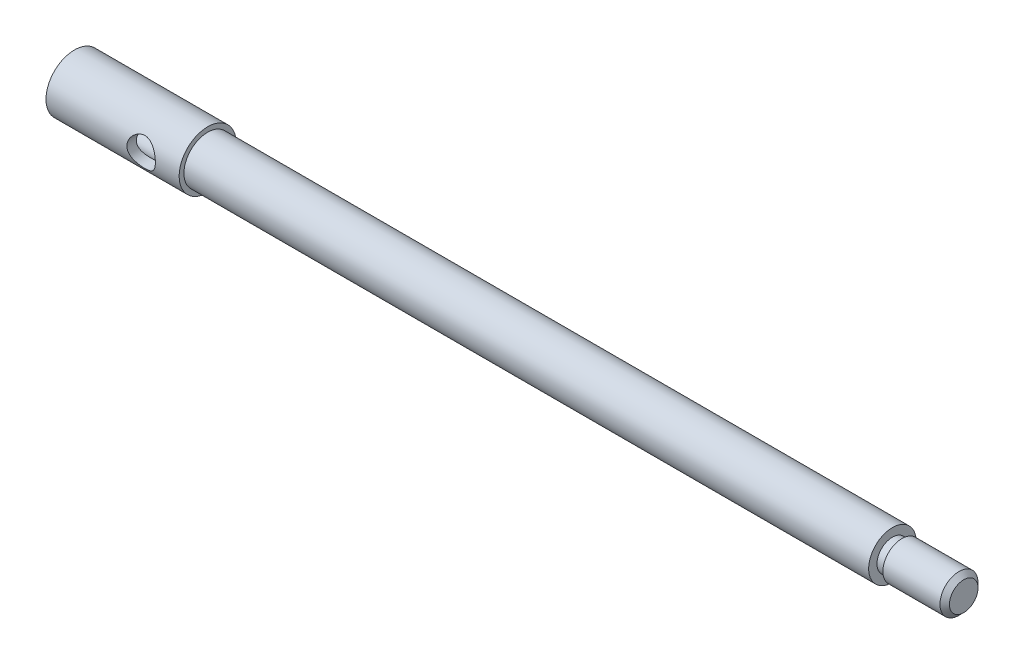
ISO-10303-21;
HEADER;
FILE_DESCRIPTION(('STEP AP214'),'2;1');
FILE_NAME('part.step','',(''),(''),'','','');
FILE_SCHEMA(('AUTOMOTIVE_DESIGN { 1 0 10303 214 1 1 1 1 }'));
ENDSEC;
DATA;
#1=APPLICATION_CONTEXT('core data for automotive mechanical design processes');
#2=APPLICATION_PROTOCOL_DEFINITION('international standard','automotive_design',2000,#1);
#3=PRODUCT_CONTEXT('',#1,'mechanical');
#4=PRODUCT('Part','Part','',(#3));
#5=PRODUCT_RELATED_PRODUCT_CATEGORY('part','',(#4));
#6=PRODUCT_DEFINITION_FORMATION('','',#4);
#7=PRODUCT_DEFINITION_CONTEXT('part definition',#1,'design');
#8=PRODUCT_DEFINITION('design','',#6,#7);
#9=PRODUCT_DEFINITION_SHAPE('','',#8);
#10=(LENGTH_UNIT() NAMED_UNIT(*) SI_UNIT(.MILLI.,.METRE.));
#11=(NAMED_UNIT(*) PLANE_ANGLE_UNIT() SI_UNIT($,.RADIAN.));
#12=(NAMED_UNIT(*) SI_UNIT($,.STERADIAN.) SOLID_ANGLE_UNIT());
#13=UNCERTAINTY_MEASURE_WITH_UNIT(LENGTH_MEASURE(1.E-05),#10,'distance_accuracy_value','');
#14=(GEOMETRIC_REPRESENTATION_CONTEXT(3) GLOBAL_UNCERTAINTY_ASSIGNED_CONTEXT((#13)) GLOBAL_UNIT_ASSIGNED_CONTEXT((#10,
#11,#12)) REPRESENTATION_CONTEXT('',''));
#15=CARTESIAN_POINT('',(0.,0.,0.));
#16=DIRECTION('',(0.,0.,1.));
#17=DIRECTION('',(1.,0.,0.));
#18=AXIS2_PLACEMENT_3D('',#15,#16,#17);
#19=CARTESIAN_POINT('',(-187.,0.,0.));
#20=DIRECTION('',(1.,0.,0.));
#21=DIRECTION('',(0.,0.,-1.));
#22=AXIS2_PLACEMENT_3D('',#19,#20,#21);
#23=CYLINDRICAL_SURFACE('',#22,6.);
#24=CARTESIAN_POINT('',(-187.,0.,0.));
#25=DIRECTION('',(-1.,0.,0.));
#26=DIRECTION('',(0.,0.,1.));
#27=AXIS2_PLACEMENT_3D('',#24,#25,#26);
#28=CIRCLE('',#27,6.);
#29=CARTESIAN_POINT('',(-187.,0.,6.));
#30=VERTEX_POINT('',#29);
#31=EDGE_CURVE('E66',#30,#30,#28,.T.);
#32=ORIENTED_EDGE('',*,*,#31,.F.);
#33=EDGE_LOOP('',(#32));
#34=FACE_BOUND('',#33,.T.);
#35=CARTESIAN_POINT('',(-159.,0.,0.));
#36=DIRECTION('',(-1.,0.,0.));
#37=DIRECTION('',(0.,0.,1.));
#38=AXIS2_PLACEMENT_3D('',#35,#36,#37);
#39=CIRCLE('',#38,6.);
#40=CARTESIAN_POINT('',(-159.,0.,6.));
#41=VERTEX_POINT('',#40);
#42=EDGE_CURVE('E62',#41,#41,#39,.T.);
#43=ORIENTED_EDGE('',*,*,#42,.T.);
#44=EDGE_LOOP('',(#43));
#45=FACE_BOUND('',#44,.T.);
#46=CARTESIAN_POINT('',(-170.,0.,6.));
#47=CARTESIAN_POINT('',(-169.99999916126,-0.0788941476270894,5.99999934964153));
#48=CARTESIAN_POINT('',(-169.996882054524,-0.157796620407949,5.99843869002385));
#49=CARTESIAN_POINT('',(-169.98446072826,-0.315001991255921,5.99224358793258));
#50=CARTESIAN_POINT('',(-169.975153725935,-0.393304603620534,5.98760776295702));
#51=CARTESIAN_POINT('',(-169.938042143181,-0.626628691373742,5.96921978027472));
#52=CARTESIAN_POINT('',(-169.901047170937,-0.779952894844981,5.95098734455496));
#53=CARTESIAN_POINT('',(-169.804418225571,-1.07683586335997,5.90448966743082));
#54=CARTESIAN_POINT('',(-169.744872233792,-1.22043005484386,5.87626344365678));
#55=CARTESIAN_POINT('',(-169.605288749321,-1.49540820515376,5.81237302716333));
#56=CARTESIAN_POINT('',(-169.525252872297,-1.62679312559149,5.77670942093694));
#57=CARTESIAN_POINT('',(-169.341446019151,-1.88252701271778,5.69868752298932));
#58=CARTESIAN_POINT('',(-169.236532052479,-2.0059694541685,5.65605474586613));
#59=CARTESIAN_POINT('',(-169.008444078513,-2.23433451090185,5.56980033629331));
#60=CARTESIAN_POINT('',(-168.885256286835,-2.3392430135573,5.5261779786051));
#61=CARTESIAN_POINT('',(-168.612515639918,-2.53576864722248,5.43896347969577));
#62=CARTESIAN_POINT('',(-168.461659025542,-2.625724111766,5.3956360268673));
#63=CARTESIAN_POINT('',(-168.224049145977,-2.74034031450289,5.33782449719395));
#64=CARTESIAN_POINT('',(-168.142929075437,-2.77516786882116,5.31974570840246));
#65=CARTESIAN_POINT('',(-167.97739942012,-2.83769299596483,5.28665768365287));
#66=CARTESIAN_POINT('',(-167.892991812742,-2.86539478083935,5.27164663543394));
#67=CARTESIAN_POINT('',(-167.726604203238,-2.91188280266505,5.24610341708084));
#68=CARTESIAN_POINT('',(-167.644777203244,-2.93110042292906,5.23535838565203));
#69=CARTESIAN_POINT('',(-167.47944509148,-2.96263559384679,5.21757784151146));
#70=CARTESIAN_POINT('',(-167.395940894459,-2.97495680535109,5.21054036082126));
#71=CARTESIAN_POINT('',(-167.227993632584,-2.99251382412704,5.20047756645272));
#72=CARTESIAN_POINT('',(-167.143551164106,-2.99775389857937,5.19744983647106));
#73=CARTESIAN_POINT('',(-166.974506345659,-3.00108452416054,5.19552555967192));
#74=CARTESIAN_POINT('',(-166.889904011712,-2.9991757574161,5.19662861870362));
#75=CARTESIAN_POINT('',(-166.657246101678,-2.98404973540404,5.20534668059274));
#76=CARTESIAN_POINT('',(-166.509755845846,-2.96335042632723,5.21726794353739));
#77=CARTESIAN_POINT('',(-166.220806323175,-2.90082280036694,5.25228182412118));
#78=CARTESIAN_POINT('',(-166.079348993049,-2.85898775295595,5.2753780002338));
#79=CARTESIAN_POINT('',(-165.802320349703,-2.75462843937305,5.33062568888727));
#80=CARTESIAN_POINT('',(-165.666962888249,-2.69164495870316,5.36297559567996));
#81=CARTESIAN_POINT('',(-165.408095036686,-2.54712530575799,5.43310175251306));
#82=CARTESIAN_POINT('',(-165.28459000352,-2.46558080007524,5.47088043711311));
#83=CARTESIAN_POINT('',(-165.03643690622,-2.27419808739746,5.55339485686877));
#84=CARTESIAN_POINT('',(-164.913629557616,-2.16208335434884,5.59840533924979));
#85=CARTESIAN_POINT('',(-164.687793565798,-1.918666756993,5.6864286668495));
#86=CARTESIAN_POINT('',(-164.584774375094,-1.78735577540357,5.72944054996685));
#87=CARTESIAN_POINT('',(-164.396943067981,-1.50154951155101,5.81105962769461));
#88=CARTESIAN_POINT('',(-164.313198596302,-1.34626077321059,5.84936952731879));
#89=CARTESIAN_POINT('',(-164.173708899242,-1.02139864805274,5.91473643118065));
#90=CARTESIAN_POINT('',(-164.11794144145,-0.851836729203675,5.94180236767508));
#91=CARTESIAN_POINT('',(-164.040573792064,-0.518299474608029,5.97973001282228));
#92=CARTESIAN_POINT('',(-164.016526293618,-0.355024591545112,5.99174814919366));
#93=CARTESIAN_POINT('',(-163.995605805738,-0.0263387999478738,6.00219040361882));
#94=CARTESIAN_POINT('',(-163.998719942861,0.139071059584267,6.00062096160122));
#95=CARTESIAN_POINT('',(-164.03062006546,0.453698915981443,5.98473576763842));
#96=CARTESIAN_POINT('',(-164.057397598244,0.60317822415514,5.97141737064974));
#97=CARTESIAN_POINT('',(-164.132714215631,0.895220676900472,5.93466513944052));
#98=CARTESIAN_POINT('',(-164.181255699349,1.03778305707535,5.91123019004896));
#99=CARTESIAN_POINT('',(-164.299995399311,1.31666582534657,5.85552754239056));
#100=CARTESIAN_POINT('',(-164.370773150341,1.45269119100304,5.82302645301465));
#101=CARTESIAN_POINT('',(-164.531322606947,1.71138408511219,5.75231922959683));
#102=CARTESIAN_POINT('',(-164.621102403829,1.83404588938514,5.71411066728832));
#103=CARTESIAN_POINT('',(-164.827281275944,2.07530306780483,5.63124663977895));
#104=CARTESIAN_POINT('',(-164.945428605145,2.19231623321554,5.58632654410487));
#105=CARTESIAN_POINT('',(-165.199775453685,2.40556896301296,5.49787174706806));
#106=CARTESIAN_POINT('',(-165.33598735658,2.50179415686849,5.45433802170281));
#107=CARTESIAN_POINT('',(-165.63093096248,2.675123743717,5.3715357665078));
#108=CARTESIAN_POINT('',(-165.790433797963,2.75107648817021,5.33257588763926));
#109=CARTESIAN_POINT('',(-166.122530203045,2.87424847703564,5.26722216885657));
#110=CARTESIAN_POINT('',(-166.295106580643,2.92150474480837,5.24081214709482));
#111=CARTESIAN_POINT('',(-166.630730667531,2.9815850649252,5.2068450303742));
#112=CARTESIAN_POINT('',(-166.79310275629,2.997278998202,5.19772150245586));
#113=CARTESIAN_POINT('',(-167.118341205507,3.00206745414685,5.19496064074355));
#114=CARTESIAN_POINT('',(-167.281207321143,2.99117350647291,5.20131659437267));
#115=CARTESIAN_POINT('',(-167.586450491094,2.94577840699521,5.227135856483));
#116=CARTESIAN_POINT('',(-167.729301362266,2.91362505078136,5.24529281646868));
#117=CARTESIAN_POINT('',(-168.007424406457,2.82952596688628,5.29113050364646));
#118=CARTESIAN_POINT('',(-168.142694125528,2.77757387249734,5.31881429411661));
#119=CARTESIAN_POINT('',(-168.411874361665,2.65144766382427,5.38285583940632));
#120=CARTESIAN_POINT('',(-168.545082969479,2.57601505988082,5.41967139666624));
#121=CARTESIAN_POINT('',(-168.797824344936,2.4064512676201,5.49706022440066));
#122=CARTESIAN_POINT('',(-168.917349946404,2.3123103512076,5.53763544397051));
#123=CARTESIAN_POINT('',(-169.154422857488,2.094616891292,5.62386853947507));
#124=CARTESIAN_POINT('',(-169.269965124161,1.96888052183389,5.66954494371953));
#125=CARTESIAN_POINT('',(-169.478801140071,1.69843715077041,5.75633712356327));
#126=CARTESIAN_POINT('',(-169.572082897022,1.55371998850182,5.79745043456127));
#127=CARTESIAN_POINT('',(-169.693178184557,1.32452333533411,5.85251406841986));
#128=CARTESIAN_POINT('',(-169.730520200242,1.24575314775786,5.86982524242744));
#129=CARTESIAN_POINT('',(-169.798361678824,1.08479725492718,5.90168845962536));
#130=CARTESIAN_POINT('',(-169.828864497033,1.0026132480538,5.91624185523758));
#131=CARTESIAN_POINT('',(-169.882607255993,0.835616997915662,5.94212690185116));
#132=CARTESIAN_POINT('',(-169.905863040764,0.750810940130687,5.95346557615479));
#133=CARTESIAN_POINT('',(-169.944882572781,0.579142357408355,5.97260771878739));
#134=CARTESIAN_POINT('',(-169.960650896556,0.492281122825507,5.98041334646939));
#135=CARTESIAN_POINT('',(-169.981684678614,0.337824895315458,5.99085829855372));
#136=CARTESIAN_POINT('',(-169.988546917726,0.270495162095326,5.99428035414515));
#137=CARTESIAN_POINT('',(-169.997705001443,0.135445671381779,5.99885151538357));
#138=CARTESIAN_POINT('',(-170.000000720009,0.0677259031748615,6.00000055829382));
#139=CARTESIAN_POINT('',(-170.,0.,6.));
#140=B_SPLINE_CURVE_WITH_KNOTS('',3,(#46,#47,#48,#49,#50,#51,#52,#53,#54,#55,#56,#57,#58,#59,
#60,#61,#62,#63,#64,#65,#66,#67,#68,#69,#70,#71,#72,#73,#74,#75,#76,#77,#78,#79,#80,#81,#82,#83,
#84,#85,#86,#87,#88,#89,#90,#91,#92,#93,#94,#95,#96,#97,#98,#99,#100,#101,#102,#103,#104,#105,
#106,#107,#108,#109,#110,#111,#112,#113,#114,#115,#116,#117,#118,#119,#120,#121,#122,#123,#124,
#125,#126,#127,#128,#129,#130,#131,#132,#133,#134,#135,#136,#137,#138,#139),.UNSPECIFIED.,.T.,
.F.,(4,2,2,2,2,2,2,2,2,2,2,2,2,2,2,2,2,2,2,2,2,2,2,2,2,2,2,2,2,2,2,2,2,2,2,2,2,2,2,2,2,2,2,2,2,
2,4),(0.,0.236611432443576,0.473329310437698,0.947100987304418,1.41904300465373,
1.89094781992153,2.39140181433109,2.89223525113893,3.43190833109938,3.70192714967834,
3.97178599119152,4.22563720033306,4.47935352842579,4.73291689564219,4.98645606901567,
5.43238672147388,5.87845946700876,6.334922554293,6.79159098704506,7.30616358925478,
7.82098138719903,8.35970601567164,8.8980018566068,9.39171406337878,9.88519228458269,
10.3404225444221,10.7957029981664,11.2640010300754,11.7324988716886,12.2470036685628,
12.7618630076938,13.3016558140826,13.8407507075944,14.3280945743222,14.8152271451712,
15.2559532566965,15.6968212128813,16.1673090526394,16.6380421835397,17.1659726319345,
17.6941868506379,17.9605054214137,18.2266930489271,18.4922945660821,18.7577335310501,
18.9608446764331,19.1639614277476),.UNSPECIFIED.);
#141=CARTESIAN_POINT('',(-170.,0.,6.));
#142=VERTEX_POINT('',#141);
#143=EDGE_CURVE('E106',#142,#142,#140,.T.);
#144=ORIENTED_EDGE('',*,*,#143,.F.);
#145=EDGE_LOOP('',(#144));
#146=FACE_BOUND('',#145,.T.);
#147=CARTESIAN_POINT('',(-170.,0.,-6.));
#148=CARTESIAN_POINT('',(-169.99999916126,0.0788941476270894,-5.99999934964153));
#149=CARTESIAN_POINT('',(-169.996882054524,0.157796620407949,-5.99843869002385));
#150=CARTESIAN_POINT('',(-169.98446072826,0.315001991255921,-5.99224358793258));
#151=CARTESIAN_POINT('',(-169.975153725935,0.393304603620534,-5.98760776295702));
#152=CARTESIAN_POINT('',(-169.938042143181,0.626628691373742,-5.96921978027472));
#153=CARTESIAN_POINT('',(-169.901047170937,0.779952894844981,-5.95098734455496));
#154=CARTESIAN_POINT('',(-169.804418225571,1.07683586335997,-5.90448966743082));
#155=CARTESIAN_POINT('',(-169.744872233792,1.22043005484386,-5.87626344365678));
#156=CARTESIAN_POINT('',(-169.605288749321,1.49540820515376,-5.81237302716333));
#157=CARTESIAN_POINT('',(-169.525252872297,1.62679312559149,-5.77670942093694));
#158=CARTESIAN_POINT('',(-169.341446019151,1.88252701271778,-5.69868752298932));
#159=CARTESIAN_POINT('',(-169.236532052479,2.0059694541685,-5.65605474586613));
#160=CARTESIAN_POINT('',(-169.008444078513,2.23433451090185,-5.56980033629331));
#161=CARTESIAN_POINT('',(-168.885256286835,2.3392430135573,-5.5261779786051));
#162=CARTESIAN_POINT('',(-168.612515639918,2.53576864722248,-5.43896347969577));
#163=CARTESIAN_POINT('',(-168.461659025542,2.625724111766,-5.3956360268673));
#164=CARTESIAN_POINT('',(-168.224049145977,2.74034031450289,-5.33782449719395));
#165=CARTESIAN_POINT('',(-168.142929075437,2.77516786882116,-5.31974570840246));
#166=CARTESIAN_POINT('',(-167.97739942012,2.83769299596483,-5.28665768365287));
#167=CARTESIAN_POINT('',(-167.892991812742,2.86539478083935,-5.27164663543394));
#168=CARTESIAN_POINT('',(-167.726604203238,2.91188280266505,-5.24610341708084));
#169=CARTESIAN_POINT('',(-167.644777203244,2.93110042292906,-5.23535838565203));
#170=CARTESIAN_POINT('',(-167.47944509148,2.96263559384679,-5.21757784151146));
#171=CARTESIAN_POINT('',(-167.395940894459,2.97495680535109,-5.21054036082126));
#172=CARTESIAN_POINT('',(-167.227993632584,2.99251382412704,-5.20047756645272));
#173=CARTESIAN_POINT('',(-167.143551164106,2.99775389857937,-5.19744983647106));
#174=CARTESIAN_POINT('',(-166.974506345659,3.00108452416054,-5.19552555967192));
#175=CARTESIAN_POINT('',(-166.889904011712,2.9991757574161,-5.19662861870362));
#176=CARTESIAN_POINT('',(-166.657246101678,2.98404973540404,-5.20534668059274));
#177=CARTESIAN_POINT('',(-166.509755845846,2.96335042632723,-5.21726794353739));
#178=CARTESIAN_POINT('',(-166.220806323175,2.90082280036694,-5.25228182412118));
#179=CARTESIAN_POINT('',(-166.079348993049,2.85898775295595,-5.2753780002338));
#180=CARTESIAN_POINT('',(-165.802320349703,2.75462843937305,-5.33062568888727));
#181=CARTESIAN_POINT('',(-165.666962888249,2.69164495870316,-5.36297559567996));
#182=CARTESIAN_POINT('',(-165.408095036686,2.54712530575799,-5.43310175251306));
#183=CARTESIAN_POINT('',(-165.28459000352,2.46558080007524,-5.47088043711311));
#184=CARTESIAN_POINT('',(-165.03643690622,2.27419808739746,-5.55339485686877));
#185=CARTESIAN_POINT('',(-164.913629557616,2.16208335434884,-5.59840533924979));
#186=CARTESIAN_POINT('',(-164.687793565798,1.918666756993,-5.6864286668495));
#187=CARTESIAN_POINT('',(-164.584774375094,1.78735577540357,-5.72944054996685));
#188=CARTESIAN_POINT('',(-164.396943067981,1.50154951155101,-5.81105962769461));
#189=CARTESIAN_POINT('',(-164.313198596302,1.34626077321059,-5.84936952731879));
#190=CARTESIAN_POINT('',(-164.173708899242,1.02139864805274,-5.91473643118065));
#191=CARTESIAN_POINT('',(-164.11794144145,0.851836729203675,-5.94180236767508));
#192=CARTESIAN_POINT('',(-164.040573792064,0.518299474608029,-5.97973001282228));
#193=CARTESIAN_POINT('',(-164.016526293618,0.355024591545112,-5.99174814919366));
#194=CARTESIAN_POINT('',(-163.995605805738,0.0263387999478738,-6.00219040361882));
#195=CARTESIAN_POINT('',(-163.998719942861,-0.139071059584267,-6.00062096160122));
#196=CARTESIAN_POINT('',(-164.03062006546,-0.453698915981443,-5.98473576763842));
#197=CARTESIAN_POINT('',(-164.057397598244,-0.60317822415514,-5.97141737064974));
#198=CARTESIAN_POINT('',(-164.132714215631,-0.895220676900472,-5.93466513944052));
#199=CARTESIAN_POINT('',(-164.181255699349,-1.03778305707535,-5.91123019004896));
#200=CARTESIAN_POINT('',(-164.299995399311,-1.31666582534657,-5.85552754239056));
#201=CARTESIAN_POINT('',(-164.370773150341,-1.45269119100304,-5.82302645301465));
#202=CARTESIAN_POINT('',(-164.531322606947,-1.71138408511219,-5.75231922959683));
#203=CARTESIAN_POINT('',(-164.621102403829,-1.83404588938514,-5.71411066728832));
#204=CARTESIAN_POINT('',(-164.827281275944,-2.07530306780483,-5.63124663977895));
#205=CARTESIAN_POINT('',(-164.945428605145,-2.19231623321554,-5.58632654410487));
#206=CARTESIAN_POINT('',(-165.199775453685,-2.40556896301296,-5.49787174706806));
#207=CARTESIAN_POINT('',(-165.33598735658,-2.50179415686849,-5.45433802170281));
#208=CARTESIAN_POINT('',(-165.63093096248,-2.675123743717,-5.3715357665078));
#209=CARTESIAN_POINT('',(-165.790433797963,-2.75107648817021,-5.33257588763926));
#210=CARTESIAN_POINT('',(-166.122530203045,-2.87424847703564,-5.26722216885657));
#211=CARTESIAN_POINT('',(-166.295106580643,-2.92150474480837,-5.24081214709482));
#212=CARTESIAN_POINT('',(-166.630730667531,-2.9815850649252,-5.2068450303742));
#213=CARTESIAN_POINT('',(-166.79310275629,-2.997278998202,-5.19772150245586));
#214=CARTESIAN_POINT('',(-167.118341205507,-3.00206745414685,-5.19496064074355));
#215=CARTESIAN_POINT('',(-167.281207321143,-2.99117350647291,-5.20131659437267));
#216=CARTESIAN_POINT('',(-167.586450491094,-2.94577840699521,-5.227135856483));
#217=CARTESIAN_POINT('',(-167.729301362266,-2.91362505078136,-5.24529281646868));
#218=CARTESIAN_POINT('',(-168.007424406457,-2.82952596688628,-5.29113050364646));
#219=CARTESIAN_POINT('',(-168.142694125528,-2.77757387249734,-5.31881429411661));
#220=CARTESIAN_POINT('',(-168.411874361665,-2.65144766382427,-5.38285583940632));
#221=CARTESIAN_POINT('',(-168.545082969479,-2.57601505988082,-5.41967139666624));
#222=CARTESIAN_POINT('',(-168.797824344936,-2.4064512676201,-5.49706022440066));
#223=CARTESIAN_POINT('',(-168.917349946404,-2.3123103512076,-5.53763544397051));
#224=CARTESIAN_POINT('',(-169.154422857488,-2.094616891292,-5.62386853947507));
#225=CARTESIAN_POINT('',(-169.269965124161,-1.96888052183389,-5.66954494371953));
#226=CARTESIAN_POINT('',(-169.478801140071,-1.69843715077041,-5.75633712356327));
#227=CARTESIAN_POINT('',(-169.572082897022,-1.55371998850182,-5.79745043456127));
#228=CARTESIAN_POINT('',(-169.693178184557,-1.32452333533411,-5.85251406841986));
#229=CARTESIAN_POINT('',(-169.730520200242,-1.24575314775786,-5.86982524242744));
#230=CARTESIAN_POINT('',(-169.798361678824,-1.08479725492718,-5.90168845962536));
#231=CARTESIAN_POINT('',(-169.828864497033,-1.0026132480538,-5.91624185523758));
#232=CARTESIAN_POINT('',(-169.882607255993,-0.835616997915662,-5.94212690185116));
#233=CARTESIAN_POINT('',(-169.905863040764,-0.750810940130687,-5.95346557615479));
#234=CARTESIAN_POINT('',(-169.944882572781,-0.579142357408355,-5.97260771878739));
#235=CARTESIAN_POINT('',(-169.960650896556,-0.492281122825507,-5.98041334646939));
#236=CARTESIAN_POINT('',(-169.981684678614,-0.337824895315458,-5.99085829855372));
#237=CARTESIAN_POINT('',(-169.988546917726,-0.270495162095326,-5.99428035414515));
#238=CARTESIAN_POINT('',(-169.997705001443,-0.135445671381779,-5.99885151538357));
#239=CARTESIAN_POINT('',(-170.000000720009,-0.0677259031748615,-6.00000055829382));
#240=CARTESIAN_POINT('',(-170.,0.,-6.));
#241=B_SPLINE_CURVE_WITH_KNOTS('',3,(#147,#148,#149,#150,#151,#152,#153,#154,#155,#156,#157,
#158,#159,#160,#161,#162,#163,#164,#165,#166,#167,#168,#169,#170,#171,#172,#173,#174,#175,#176,
#177,#178,#179,#180,#181,#182,#183,#184,#185,#186,#187,#188,#189,#190,#191,#192,#193,#194,#195,
#196,#197,#198,#199,#200,#201,#202,#203,#204,#205,#206,#207,#208,#209,#210,#211,#212,#213,#214,
#215,#216,#217,#218,#219,#220,#221,#222,#223,#224,#225,#226,#227,#228,#229,#230,#231,#232,#233,
#234,#235,#236,#237,#238,#239,#240),.UNSPECIFIED.,.T.,.F.,(4,2,2,2,2,2,2,2,2,2,2,2,2,2,2,2,2,2,
2,2,2,2,2,2,2,2,2,2,2,2,2,2,2,2,2,2,2,2,2,2,2,2,2,2,2,2,4),(0.,0.236611432443576,
0.473329310437698,0.947100987304418,1.41904300465373,1.89094781992153,2.39140181433109,
2.89223525113893,3.43190833109938,3.70192714967834,3.97178599119152,4.22563720033306,
4.47935352842579,4.73291689564219,4.98645606901567,5.43238672147388,5.87845946700876,
6.334922554293,6.79159098704506,7.30616358925478,7.82098138719903,8.35970601567164,
8.8980018566068,9.39171406337878,9.88519228458269,10.3404225444221,10.7957029981664,
11.2640010300754,11.7324988716886,12.2470036685628,12.7618630076938,13.3016558140826,
13.8407507075944,14.3280945743222,14.8152271451712,15.2559532566965,15.6968212128813,
16.1673090526394,16.6380421835397,17.1659726319345,17.6941868506379,17.9605054214137,
18.2266930489271,18.4922945660821,18.7577335310501,18.9608446764331,19.1639614277476),.UNSPECIFIED.);
#242=CARTESIAN_POINT('',(-170.,0.,-6.));
#243=VERTEX_POINT('',#242);
#244=EDGE_CURVE('E69',#243,#243,#241,.T.);
#245=ORIENTED_EDGE('',*,*,#244,.F.);
#246=EDGE_LOOP('',(#245));
#247=FACE_BOUND('',#246,.T.);
#248=ADVANCED_FACE('F35',(#34,#45,#146,#247),#23,.T.);
#249=CARTESIAN_POINT('',(-187.,0.,0.));
#250=DIRECTION('',(-1.,0.,0.));
#251=DIRECTION('',(0.,0.,1.));
#252=AXIS2_PLACEMENT_3D('',#249,#250,#251);
#253=CYLINDRICAL_SURFACE('',#252,4.);
#254=CARTESIAN_POINT('',(-162.,0.,0.));
#255=DIRECTION('',(-1.,0.,0.));
#256=DIRECTION('',(0.,0.,1.));
#257=AXIS2_PLACEMENT_3D('',#254,#255,#256);
#258=CIRCLE('',#257,3.99999999999999);
#259=CARTESIAN_POINT('',(-162.,0.,3.99999999999999));
#260=VERTEX_POINT('',#259);
#261=EDGE_CURVE('E60',#260,#260,#258,.T.);
#262=ORIENTED_EDGE('',*,*,#261,.F.);
#263=EDGE_LOOP('',(#262));
#264=FACE_BOUND('',#263,.T.);
#265=CARTESIAN_POINT('',(-187.,0.,0.));
#266=DIRECTION('',(-1.,0.,0.));
#267=DIRECTION('',(0.,0.,1.));
#268=AXIS2_PLACEMENT_3D('',#265,#266,#267);
#269=CIRCLE('',#268,4.);
#270=CARTESIAN_POINT('',(-187.,0.,4.));
#271=VERTEX_POINT('',#270);
#272=EDGE_CURVE('E63',#271,#271,#269,.T.);
#273=ORIENTED_EDGE('',*,*,#272,.T.);
#274=EDGE_LOOP('',(#273));
#275=FACE_BOUND('',#274,.T.);
#276=CARTESIAN_POINT('',(-170.,0.,-4.));
#277=CARTESIAN_POINT('',(-169.999999257981,-0.0732613677680268,-3.99999929901188));
#278=CARTESIAN_POINT('',(-169.997309493013,-0.146542351053626,-3.99798060344642));
#279=CARTESIAN_POINT('',(-169.986605139865,-0.292508538993503,-3.98996245699389));
#280=CARTESIAN_POINT('',(-169.978587365495,-0.365193360793216,-3.98396062416368));
#281=CARTESIAN_POINT('',(-169.946664093972,-0.581731406983923,-3.96012745087106));
#282=CARTESIAN_POINT('',(-169.914889042009,-0.723892660392386,-3.93646888013437));
#283=CARTESIAN_POINT('',(-169.832574792425,-0.998506639011305,-3.87591490407891));
#284=CARTESIAN_POINT('',(-169.782149651617,-1.13101263465653,-3.8391000031407));
#285=CARTESIAN_POINT('',(-169.664914633068,-1.38483526994093,-3.75501017021524));
#286=CARTESIAN_POINT('',(-169.598109548417,-1.50615516858413,-3.70773829853535));
#287=CARTESIAN_POINT('',(-169.443476274779,-1.74693213195157,-3.60099357013527));
#288=CARTESIAN_POINT('',(-169.354274148727,-1.86517631030519,-3.54079623314279));
#289=CARTESIAN_POINT('',(-169.160999504157,-2.08606449940779,-3.41533027981217));
#290=CARTESIAN_POINT('',(-169.056904027552,-2.18868391091459,-3.35005390635212));
#291=CARTESIAN_POINT('',(-168.879464655895,-2.33993228026195,-3.24492237261661));
#292=CARTESIAN_POINT('',(-168.810369887591,-2.39379458304144,-3.2052891581058));
#293=CARTESIAN_POINT('',(-168.667410869176,-2.49548358548255,-3.12676887933752));
#294=CARTESIAN_POINT('',(-168.593545190949,-2.54330846513547,-3.0878820430606));
#295=CARTESIAN_POINT('',(-168.44122820512,-2.63261178619331,-3.01210562553027));
#296=CARTESIAN_POINT('',(-168.362782562038,-2.67409784691838,-2.9752136814322));
#297=CARTESIAN_POINT('',(-168.201292952451,-2.7504313267714,-2.90479339731392));
#298=CARTESIAN_POINT('',(-168.118249733286,-2.78527982077503,-2.87126451310281));
#299=CARTESIAN_POINT('',(-167.921037724576,-2.85760090658948,-2.7995453278082));
#300=CARTESIAN_POINT('',(-167.805230226065,-2.89251037008407,-2.76315561923757));
#301=CARTESIAN_POINT('',(-167.567202936866,-2.94841656316141,-2.70343128888207));
#302=CARTESIAN_POINT('',(-167.444998525663,-2.96944514417497,-2.68006679839941));
#303=CARTESIAN_POINT('',(-167.195637975528,-2.99625559824299,-2.65007535494333));
#304=CARTESIAN_POINT('',(-167.068447226717,-3.00189887157292,-2.6436005765876));
#305=CARTESIAN_POINT('',(-166.814769337771,-2.99696449042943,-2.64919059245027));
#306=CARTESIAN_POINT('',(-166.688282466205,-2.9863810204854,-2.66126203341492));
#307=CARTESIAN_POINT('',(-166.453617495941,-2.95195473462658,-2.69935247502784));
#308=CARTESIAN_POINT('',(-166.344927309864,-2.92964971367058,-2.72374314386007));
#309=CARTESIAN_POINT('',(-166.133122190552,-2.87411343637386,-2.78228385423354));
#310=CARTESIAN_POINT('',(-166.030012727386,-2.84087167817738,-2.81644327194563));
#311=CARTESIAN_POINT('',(-165.767487254313,-2.74066127604794,-2.91483538729991));
#312=CARTESIAN_POINT('',(-165.613199174116,-2.66560296789392,-2.98451298316588));
#313=CARTESIAN_POINT('',(-165.32160694484,-2.49236046828097,-3.13066596252171));
#314=CARTESIAN_POINT('',(-165.184345319484,-2.39412008565054,-3.2071575776123));
#315=CARTESIAN_POINT('',(-164.924493221249,-2.1730320814964,-3.36103344637549));
#316=CARTESIAN_POINT('',(-164.802358786768,-2.04962751039988,-3.43839173465925));
#317=CARTESIAN_POINT('',(-164.579472705908,-1.78084504353991,-3.58496075956502));
#318=CARTESIAN_POINT('',(-164.478680159471,-1.63551010852553,-3.65418696516998));
#319=CARTESIAN_POINT('',(-164.320038401574,-1.35580416095798,-3.76559452155692));
#320=CARTESIAN_POINT('',(-164.257630811426,-1.22507974062699,-3.81041541916799));
#321=CARTESIAN_POINT('',(-164.151550239215,-0.952704346148762,-3.88745808807123));
#322=CARTESIAN_POINT('',(-164.107865523627,-0.811060281155487,-3.91968774910056));
#323=CARTESIAN_POINT('',(-164.041493273598,-0.519352465945192,-3.96891177371225));
#324=CARTESIAN_POINT('',(-164.018935639743,-0.369242566477572,-3.98581186314605));
#325=CARTESIAN_POINT('',(-163.996900807636,-0.0664024759298644,-4.00231766947938));
#326=CARTESIAN_POINT('',(-163.997413871495,0.0863265824212415,-4.0019306830649));
#327=CARTESIAN_POINT('',(-164.020221730555,0.373608422358493,-3.9848509559687));
#328=CARTESIAN_POINT('',(-164.040321045342,0.508444611327511,-3.96980177630784));
#329=CARTESIAN_POINT('',(-164.097947588457,0.772221384992164,-3.92702635972252));
#330=CARTESIAN_POINT('',(-164.13547852516,0.901160708783158,-3.89929742534595));
#331=CARTESIAN_POINT('',(-164.227774951672,1.15483339082481,-3.83199678428179));
#332=CARTESIAN_POINT('',(-164.28310194755,1.2792577058744,-3.79204165281686));
#333=CARTESIAN_POINT('',(-164.408345326214,1.51703769337238,-3.70333906113675));
#334=CARTESIAN_POINT('',(-164.478263727299,1.63039183139356,-3.65459038471488));
#335=CARTESIAN_POINT('',(-164.643564681614,1.8630204649999,-3.54238575945116));
#336=CARTESIAN_POINT('',(-164.74124979478,1.98012231440918,-3.47783324856003));
#337=CARTESIAN_POINT('',(-164.952024805635,2.19745073328877,-3.34476768394497));
#338=CARTESIAN_POINT('',(-165.065148814663,2.29763880438276,-3.27624605925977));
#339=CARTESIAN_POINT('',(-165.256829830342,2.44323760962611,-3.16783641864788));
#340=CARTESIAN_POINT('',(-165.330857858206,2.49441207840982,-3.12757855224157));
#341=CARTESIAN_POINT('',(-165.483826722128,2.59024776181553,-3.04868523124077));
#342=CARTESIAN_POINT('',(-165.562769348085,2.63490658340159,-3.01005037642929));
#343=CARTESIAN_POINT('',(-165.806582868188,2.75840992843583,-2.89884735629491));
#344=CARTESIAN_POINT('',(-165.97902187616,2.82722866554616,-2.83062934493715));
#345=CARTESIAN_POINT('',(-166.270846234245,2.91232161832904,-2.74237306217231));
#346=CARTESIAN_POINT('',(-166.384786840491,2.93862206696067,-2.71391502535154));
#347=CARTESIAN_POINT('',(-166.617409516566,2.9778285711449,-2.6708423304846));
#348=CARTESIAN_POINT('',(-166.736080383373,2.99076452454842,-2.65619677881273));
#349=CARTESIAN_POINT('',(-166.975659195061,3.00230698654586,-2.64315167964508));
#350=CARTESIAN_POINT('',(-167.096575414454,3.00084075038308,-2.64483460597191));
#351=CARTESIAN_POINT('',(-167.336114149678,2.98353723231362,-2.66432917886907));
#352=CARTESIAN_POINT('',(-167.45473350382,2.96768140541027,-2.6821616385503));
#353=CARTESIAN_POINT('',(-167.711825575585,2.91787829237154,-2.73634639677124));
#354=CARTESIAN_POINT('',(-167.84897923464,2.88073715900695,-2.7758918581173));
#355=CARTESIAN_POINT('',(-168.113084861707,2.7893867306652,-2.86766153434686));
#356=CARTESIAN_POINT('',(-168.240010031912,2.73513432117037,-2.91991769887721));
#357=CARTESIAN_POINT('',(-168.443272479835,2.63161322454646,-3.01293440174577));
#358=CARTESIAN_POINT('',(-168.522614856295,2.58648316812394,-3.05189072454859));
#359=CARTESIAN_POINT('',(-168.676314723533,2.4896225778243,-3.13140535919088));
#360=CARTESIAN_POINT('',(-168.750672480033,2.43789239621913,-3.17196358545141));
#361=CARTESIAN_POINT('',(-168.89435546071,2.32800429973177,-3.25347248479449));
#362=CARTESIAN_POINT('',(-168.963676348761,2.26984095281456,-3.29442346245131));
#363=CARTESIAN_POINT('',(-169.097020174866,2.14725580217525,-3.37560324351164));
#364=CARTESIAN_POINT('',(-169.161042851557,2.08283369004469,-3.41583201121149));
#365=CARTESIAN_POINT('',(-169.283973333077,1.94728190281504,-3.49489651383708));
#366=CARTESIAN_POINT('',(-169.342833081361,1.87609990910423,-3.53371751668989));
#367=CARTESIAN_POINT('',(-169.454329757063,1.72767987087962,-3.60860502556327));
#368=CARTESIAN_POINT('',(-169.506967991795,1.65044310433575,-3.64467210969297));
#369=CARTESIAN_POINT('',(-169.605341942055,1.49030317410504,-3.7130254144582));
#370=CARTESIAN_POINT('',(-169.651089596432,1.40741018139547,-3.74531815237996));
#371=CARTESIAN_POINT('',(-169.735056716043,1.23634243548308,-3.80521640467825));
#372=CARTESIAN_POINT('',(-169.773280066506,1.14817043896922,-3.83282433706665));
#373=CARTESIAN_POINT('',(-169.855562698967,0.929739140257703,-3.89270294176919));
#374=CARTESIAN_POINT('',(-169.895524362818,0.797123031202167,-3.92219862865413));
#375=CARTESIAN_POINT('',(-169.956844879589,0.525667463530746,-3.96768259876895));
#376=CARTESIAN_POINT('',(-169.978255686788,0.386846538130372,-3.98370860194078));
#377=CARTESIAN_POINT('',(-169.993209298623,0.205928000583226,-3.99490938201699));
#378=CARTESIAN_POINT('',(-169.995753102821,0.164816108820263,-3.99681576437033));
#379=CARTESIAN_POINT('',(-169.999148798532,0.082471562059357,-3.99936137264782));
#380=CARTESIAN_POINT('',(-170.000000417683,0.0412388886906801,-4.00000039458683));
#381=CARTESIAN_POINT('',(-170.,0.,-4.));
#382=B_SPLINE_CURVE_WITH_KNOTS('',3,(#276,#277,#278,#279,#280,#281,#282,#283,#284,#285,#286,
#287,#288,#289,#290,#291,#292,#293,#294,#295,#296,#297,#298,#299,#300,#301,#302,#303,#304,#305,
#306,#307,#308,#309,#310,#311,#312,#313,#314,#315,#316,#317,#318,#319,#320,#321,#322,#323,#324,
#325,#326,#327,#328,#329,#330,#331,#332,#333,#334,#335,#336,#337,#338,#339,#340,#341,#342,#343,
#344,#345,#346,#347,#348,#349,#350,#351,#352,#353,#354,#355,#356,#357,#358,#359,#360,#361,#362,
#363,#364,#365,#366,#367,#368,#369,#370,#371,#372,#373,#374,#375,#376,#377,#378,#379,#380,#381),
.UNSPECIFIED.,.T.,.F.,(4,2,2,2,2,2,2,2,2,2,2,2,2,2,2,2,2,2,2,2,2,2,2,2,2,2,2,2,2,2,2,2,2,2,2,2,
2,2,2,2,2,2,2,2,2,2,2,2,2,2,2,2,4),(0.,0.219733524191397,0.439598569068991,0.879847634771395,
1.31744766307168,1.7549197936235,2.2329036222735,2.71163236402815,2.99983518527189,
3.28812468015056,3.57606487508901,3.86395840178996,4.24151729125781,4.61820678456559,
4.99827867308493,5.37848680666397,5.71806472391393,6.05796967267257,6.61051355677797,
7.16441076781754,7.73224459942155,8.29898017053352,8.7520570207875,9.20484951352207,
9.6604080839977,10.115774369992,10.5253506608996,10.935014124376,11.3591357103333,
11.7833160002106,12.2783345622971,12.7744651003687,13.0698938265095,13.3654307846346,
13.954090781318,14.3138420927745,14.6727868466001,15.0335455414109,15.3947698355933,
15.834852283519,16.2760525671148,16.5734564783341,16.8708445226933,17.1684856206862,
17.4661413927619,17.7663250552983,18.066445528328,18.3660398682402,18.6654791022957,
19.088448647665,19.5102297424975,19.6338980344063,19.7575862294511),.UNSPECIFIED.);
#383=CARTESIAN_POINT('',(-170.,0.,-4.));
#384=VERTEX_POINT('',#383);
#385=EDGE_CURVE('E91',#384,#384,#382,.T.);
#386=ORIENTED_EDGE('',*,*,#385,.F.);
#387=EDGE_LOOP('',(#386));
#388=FACE_BOUND('',#387,.T.);
#389=CARTESIAN_POINT('',(-164.,0.,4.));
#390=CARTESIAN_POINT('',(-164.000000742019,-0.0732613677680268,3.99999929901188));
#391=CARTESIAN_POINT('',(-164.002690506987,-0.146542351053626,3.99798060344642));
#392=CARTESIAN_POINT('',(-164.013394860135,-0.292508538993503,3.98996245699389));
#393=CARTESIAN_POINT('',(-164.021412634505,-0.365193360793216,3.98396062416368));
#394=CARTESIAN_POINT('',(-164.053335906028,-0.581731406983923,3.96012745087106));
#395=CARTESIAN_POINT('',(-164.085110957991,-0.723892660392386,3.93646888013437));
#396=CARTESIAN_POINT('',(-164.167425207575,-0.998506639011305,3.87591490407891));
#397=CARTESIAN_POINT('',(-164.217850348383,-1.13101263465653,3.8391000031407));
#398=CARTESIAN_POINT('',(-164.335085366932,-1.38483526994093,3.75501017021524));
#399=CARTESIAN_POINT('',(-164.401890451584,-1.50615516858413,3.70773829853535));
#400=CARTESIAN_POINT('',(-164.556523725221,-1.74693213195157,3.60099357013527));
#401=CARTESIAN_POINT('',(-164.645725851273,-1.86517631030519,3.54079623314279));
#402=CARTESIAN_POINT('',(-164.839000495843,-2.08606449940779,3.41533027981217));
#403=CARTESIAN_POINT('',(-164.943095972448,-2.18868391091459,3.35005390635212));
#404=CARTESIAN_POINT('',(-165.120535344105,-2.33993228026195,3.24492237261661));
#405=CARTESIAN_POINT('',(-165.18963011241,-2.39379458304144,3.2052891581058));
#406=CARTESIAN_POINT('',(-165.332589130824,-2.49548358548255,3.12676887933752));
#407=CARTESIAN_POINT('',(-165.406454809051,-2.54330846513547,3.0878820430606));
#408=CARTESIAN_POINT('',(-165.55877179488,-2.63261178619331,3.01210562553027));
#409=CARTESIAN_POINT('',(-165.637217437963,-2.67409784691838,2.9752136814322));
#410=CARTESIAN_POINT('',(-165.798707047549,-2.7504313267714,2.90479339731392));
#411=CARTESIAN_POINT('',(-165.881750266714,-2.78527982077503,2.87126451310281));
#412=CARTESIAN_POINT('',(-166.078962275424,-2.85760090658949,2.7995453278082));
#413=CARTESIAN_POINT('',(-166.194769773935,-2.89251037008407,2.76315561923757));
#414=CARTESIAN_POINT('',(-166.432797063134,-2.94841656316142,2.70343128888206));
#415=CARTESIAN_POINT('',(-166.555001474337,-2.96944514417498,2.68006679839941));
#416=CARTESIAN_POINT('',(-166.804362024472,-2.99625559824299,2.65007535494333));
#417=CARTESIAN_POINT('',(-166.931552773283,-3.00189887157292,2.6436005765876));
#418=CARTESIAN_POINT('',(-167.185230662229,-2.99696449042943,2.64919059245027));
#419=CARTESIAN_POINT('',(-167.311717533795,-2.9863810204854,2.66126203341492));
#420=CARTESIAN_POINT('',(-167.54638250406,-2.95195473462658,2.69935247502784));
#421=CARTESIAN_POINT('',(-167.655072690136,-2.92964971367058,2.72374314386007));
#422=CARTESIAN_POINT('',(-167.866877809448,-2.87411343637386,2.78228385423354));
#423=CARTESIAN_POINT('',(-167.969987272614,-2.84087167817738,2.81644327194563));
#424=CARTESIAN_POINT('',(-168.232512745687,-2.74066127604794,2.91483538729991));
#425=CARTESIAN_POINT('',(-168.386800825884,-2.66560296789392,2.98451298316588));
#426=CARTESIAN_POINT('',(-168.67839305516,-2.49236046828097,3.13066596252171));
#427=CARTESIAN_POINT('',(-168.815654680516,-2.39412008565054,3.2071575776123));
#428=CARTESIAN_POINT('',(-169.075506778751,-2.1730320814964,3.36103344637549));
#429=CARTESIAN_POINT('',(-169.197641213232,-2.04962751039988,3.43839173465925));
#430=CARTESIAN_POINT('',(-169.420527294092,-1.78084504353991,3.58496075956502));
#431=CARTESIAN_POINT('',(-169.521319840529,-1.63551010852553,3.65418696516998));
#432=CARTESIAN_POINT('',(-169.679961598426,-1.35580416095798,3.76559452155692));
#433=CARTESIAN_POINT('',(-169.742369188574,-1.22507974062699,3.81041541916799));
#434=CARTESIAN_POINT('',(-169.848449760785,-0.952704346148762,3.88745808807123));
#435=CARTESIAN_POINT('',(-169.892134476373,-0.811060281155487,3.91968774910056));
#436=CARTESIAN_POINT('',(-169.958506726402,-0.519352465945192,3.96891177371225));
#437=CARTESIAN_POINT('',(-169.981064360257,-0.369242566477572,3.98581186314605));
#438=CARTESIAN_POINT('',(-170.003099192364,-0.0664024759298644,4.00231766947938));
#439=CARTESIAN_POINT('',(-170.002586128506,0.0863265824212416,4.0019306830649));
#440=CARTESIAN_POINT('',(-169.979778269445,0.373608422358491,3.9848509559687));
#441=CARTESIAN_POINT('',(-169.959678954658,0.508444611327507,3.96980177630784));
#442=CARTESIAN_POINT('',(-169.902052411543,0.77222138499216,3.92702635972253));
#443=CARTESIAN_POINT('',(-169.86452147484,0.901160708783156,3.89929742534595));
#444=CARTESIAN_POINT('',(-169.772225048329,1.15483339082481,3.83199678428179));
#445=CARTESIAN_POINT('',(-169.71689805245,1.2792577058744,3.79204165281686));
#446=CARTESIAN_POINT('',(-169.591654673787,1.51703769337238,3.70333906113675));
#447=CARTESIAN_POINT('',(-169.521736272701,1.63039183139356,3.65459038471488));
#448=CARTESIAN_POINT('',(-169.356435318386,1.8630204649999,3.54238575945116));
#449=CARTESIAN_POINT('',(-169.258750205221,1.98012231440918,3.47783324856003));
#450=CARTESIAN_POINT('',(-169.047975194365,2.19745073328877,3.34476768394497));
#451=CARTESIAN_POINT('',(-168.934851185337,2.29763880438276,3.27624605925977));
#452=CARTESIAN_POINT('',(-168.743170169658,2.44323760962611,3.16783641864788));
#453=CARTESIAN_POINT('',(-168.669142141794,2.49441207840982,3.12757855224157));
#454=CARTESIAN_POINT('',(-168.516173277873,2.59024776181553,3.04868523124077));
#455=CARTESIAN_POINT('',(-168.437230651915,2.63490658340159,3.01005037642929));
#456=CARTESIAN_POINT('',(-168.193417131812,2.75840992843583,2.89884735629491));
#457=CARTESIAN_POINT('',(-168.02097812384,2.82722866554616,2.83062934493715));
#458=CARTESIAN_POINT('',(-167.729153765755,2.91232161832904,2.74237306217231));
#459=CARTESIAN_POINT('',(-167.615213159509,2.93862206696067,2.71391502535154));
#460=CARTESIAN_POINT('',(-167.382590483435,2.9778285711449,2.6708423304846));
#461=CARTESIAN_POINT('',(-167.263919616627,2.99076452454842,2.65619677881273));
#462=CARTESIAN_POINT('',(-167.024340804939,3.00230698654586,2.64315167964508));
#463=CARTESIAN_POINT('',(-166.903424585546,3.00084075038308,2.64483460597191));
#464=CARTESIAN_POINT('',(-166.663885850322,2.98353723231362,2.66432917886907));
#465=CARTESIAN_POINT('',(-166.54526649618,2.96768140541027,2.6821616385503));
#466=CARTESIAN_POINT('',(-166.288174424415,2.91787829237154,2.73634639677124));
#467=CARTESIAN_POINT('',(-166.15102076536,2.88073715900695,2.7758918581173));
#468=CARTESIAN_POINT('',(-165.886915138293,2.7893867306652,2.86766153434686));
#469=CARTESIAN_POINT('',(-165.759989968088,2.73513432117037,2.91991769887721));
#470=CARTESIAN_POINT('',(-165.556727520165,2.63161322454646,3.01293440174578));
#471=CARTESIAN_POINT('',(-165.477385143705,2.58648316812393,3.05189072454859));
#472=CARTESIAN_POINT('',(-165.323685276467,2.48962257782429,3.13140535919089));
#473=CARTESIAN_POINT('',(-165.249327519967,2.43789239621911,3.17196358545142));
#474=CARTESIAN_POINT('',(-165.10564453929,2.32800429973175,3.2534724847945));
#475=CARTESIAN_POINT('',(-165.036323651239,2.26984095281453,3.29442346245133));
#476=CARTESIAN_POINT('',(-164.902979825134,2.14725580217523,3.37560324351165));
#477=CARTESIAN_POINT('',(-164.838957148443,2.08283369004468,3.4158320112115));
#478=CARTESIAN_POINT('',(-164.716026666923,1.94728190281504,3.49489651383708));
#479=CARTESIAN_POINT('',(-164.65716691864,1.87609990910423,3.53371751668989));
#480=CARTESIAN_POINT('',(-164.545670242937,1.72767987087963,3.60860502556327));
#481=CARTESIAN_POINT('',(-164.493032008205,1.65044310433576,3.64467210969297));
#482=CARTESIAN_POINT('',(-164.394658057945,1.49030317410504,3.7130254144582));
#483=CARTESIAN_POINT('',(-164.348910403568,1.40741018139546,3.74531815237996));
#484=CARTESIAN_POINT('',(-164.264943283957,1.23634243548308,3.80521640467825));
#485=CARTESIAN_POINT('',(-164.226719933494,1.14817043896922,3.83282433706665));
#486=CARTESIAN_POINT('',(-164.144437301033,0.929739140257703,3.89270294176919));
#487=CARTESIAN_POINT('',(-164.104475637182,0.797123031202168,3.92219862865413));
#488=CARTESIAN_POINT('',(-164.043155120411,0.525667463530746,3.96768259876895));
#489=CARTESIAN_POINT('',(-164.021744313212,0.386846538130372,3.98370860194078));
#490=CARTESIAN_POINT('',(-164.006790701377,0.205928000583226,3.99490938201699));
#491=CARTESIAN_POINT('',(-164.004246897179,0.164816108820263,3.99681576437033));
#492=CARTESIAN_POINT('',(-164.000851201468,0.082471562059357,3.99936137264782));
#493=CARTESIAN_POINT('',(-163.999999582317,0.0412388886906801,4.00000039458683));
#494=CARTESIAN_POINT('',(-164.,0.,4.));
#495=B_SPLINE_CURVE_WITH_KNOTS('',3,(#389,#390,#391,#392,#393,#394,#395,#396,#397,#398,#399,
#400,#401,#402,#403,#404,#405,#406,#407,#408,#409,#410,#411,#412,#413,#414,#415,#416,#417,#418,
#419,#420,#421,#422,#423,#424,#425,#426,#427,#428,#429,#430,#431,#432,#433,#434,#435,#436,#437,
#438,#439,#440,#441,#442,#443,#444,#445,#446,#447,#448,#449,#450,#451,#452,#453,#454,#455,#456,
#457,#458,#459,#460,#461,#462,#463,#464,#465,#466,#467,#468,#469,#470,#471,#472,#473,#474,#475,
#476,#477,#478,#479,#480,#481,#482,#483,#484,#485,#486,#487,#488,#489,#490,#491,#492,#493,#494),
.UNSPECIFIED.,.T.,.F.,(4,2,2,2,2,2,2,2,2,2,2,2,2,2,2,2,2,2,2,2,2,2,2,2,2,2,2,2,2,2,2,2,2,2,2,2,
2,2,2,2,2,2,2,2,2,2,2,2,2,2,2,2,4),(0.,0.219733524191397,0.439598569068991,0.879847634771395,
1.31744766307168,1.7549197936235,2.2329036222735,2.71163236402815,2.99983518527189,
3.28812468015056,3.576064875089,3.86395840178996,4.24151729125784,4.61820678456559,
4.99827867308492,5.37848680666396,5.71806472391392,6.05796967267256,6.61051355677796,
7.16441076781754,7.73224459942155,8.29898017053352,8.7520570207875,9.20484951352207,
9.6604080839977,10.115774369992,10.5253506608996,10.935014124376,11.3591357103333,
11.7833160002106,12.2783345622971,12.7744651003687,13.0698938265095,13.3654307846346,
13.954090781318,14.3138420927745,14.6727868466001,15.0335455414109,15.3947698355933,
15.834852283519,16.2760525671148,16.5734564783341,16.8708445226934,17.1684856206863,
17.4661413927619,17.7663250552983,18.066445528328,18.3660398682402,18.6654791022956,
19.088448647665,19.5102297424975,19.6338980344063,19.757586229451),.UNSPECIFIED.);
#496=CARTESIAN_POINT('',(-164.,0.,4.));
#497=VERTEX_POINT('',#496);
#498=EDGE_CURVE('E39',#497,#497,#495,.T.);
#499=ORIENTED_EDGE('',*,*,#498,.F.);
#500=EDGE_LOOP('',(#499));
#501=FACE_BOUND('',#500,.T.);
#502=ADVANCED_FACE('F96',(#264,#275,#388,#501),#253,.F.);
#503=CARTESIAN_POINT('',(-13.,0.,0.));
#504=DIRECTION('',(1.,0.,0.));
#505=DIRECTION('',(0.,0.,-1.));
#506=AXIS2_PLACEMENT_3D('',#503,#504,#505);
#507=CYLINDRICAL_SURFACE('',#506,4.);
#508=CARTESIAN_POINT('',(-0.999999999999949,0.,0.));
#509=DIRECTION('',(1.,0.,0.));
#510=DIRECTION('',(0.,0.,-1.));
#511=AXIS2_PLACEMENT_3D('',#508,#509,#510);
#512=CIRCLE('',#511,4.);
#513=CARTESIAN_POINT('',(-0.999999999999949,0.,-4.));
#514=VERTEX_POINT('',#513);
#515=EDGE_CURVE('E11',#514,#514,#512,.F.);
#516=CARTESIAN_POINT('',(-13.,0.,0.));
#517=DIRECTION('',(1.,0.,0.));
#518=DIRECTION('',(0.,0.,-1.));
#519=AXIS2_PLACEMENT_3D('',#516,#517,#518);
#520=CIRCLE('',#519,4.);
#521=CARTESIAN_POINT('',(-13.,0.,-4.));
#522=VERTEX_POINT('',#521);
#523=EDGE_CURVE('E84',#522,#522,#520,.T.);
#524=CARTESIAN_POINT('',(-0.999999999999949,0.,-4.));
#525=CARTESIAN_POINT('',(-1.12499999999995,0.,-4.));
#526=CARTESIAN_POINT('',(-1.24999999999995,0.,-4.));
#527=CARTESIAN_POINT('',(-1.49999999999995,0.,-4.));
#528=CARTESIAN_POINT('',(-1.62499999999995,0.,-4.));
#529=CARTESIAN_POINT('',(-1.87499999999995,0.,-4.));
#530=CARTESIAN_POINT('',(-1.99999999999995,0.,-4.));
#531=CARTESIAN_POINT('',(-2.24999999999995,0.,-4.));
#532=CARTESIAN_POINT('',(-2.37499999999995,0.,-4.));
#533=CARTESIAN_POINT('',(-2.62499999999996,0.,-4.));
#534=CARTESIAN_POINT('',(-2.74999999999996,0.,-4.));
#535=CARTESIAN_POINT('',(-2.99999999999996,0.,-4.));
#536=CARTESIAN_POINT('',(-3.12499999999996,0.,-4.));
#537=CARTESIAN_POINT('',(-3.37499999999996,0.,-4.));
#538=CARTESIAN_POINT('',(-3.49999999999996,0.,-4.));
#539=CARTESIAN_POINT('',(-3.74999999999996,0.,-4.));
#540=CARTESIAN_POINT('',(-3.87499999999996,0.,-4.));
#541=CARTESIAN_POINT('',(-4.12499999999996,0.,-4.));
#542=CARTESIAN_POINT('',(-4.24999999999996,0.,-4.));
#543=CARTESIAN_POINT('',(-4.49999999999997,0.,-4.));
#544=CARTESIAN_POINT('',(-4.62499999999997,0.,-4.));
#545=CARTESIAN_POINT('',(-4.87499999999997,0.,-4.));
#546=CARTESIAN_POINT('',(-4.99999999999997,0.,-4.));
#547=CARTESIAN_POINT('',(-5.24999999999997,0.,-4.));
#548=CARTESIAN_POINT('',(-5.37499999999997,0.,-4.));
#549=CARTESIAN_POINT('',(-5.62499999999997,0.,-4.));
#550=CARTESIAN_POINT('',(-5.74999999999997,0.,-4.));
#551=CARTESIAN_POINT('',(-5.99999999999997,0.,-4.));
#552=CARTESIAN_POINT('',(-6.12499999999997,0.,-4.));
#553=CARTESIAN_POINT('',(-6.37499999999997,0.,-4.));
#554=CARTESIAN_POINT('',(-6.49999999999997,0.,-4.));
#555=CARTESIAN_POINT('',(-6.74999999999997,0.,-4.));
#556=CARTESIAN_POINT('',(-6.87499999999997,0.,-4.));
#557=CARTESIAN_POINT('',(-7.12499999999998,0.,-4.));
#558=CARTESIAN_POINT('',(-7.24999999999998,0.,-4.));
#559=CARTESIAN_POINT('',(-7.49999999999998,0.,-4.));
#560=CARTESIAN_POINT('',(-7.62499999999998,0.,-4.));
#561=CARTESIAN_POINT('',(-7.87499999999998,0.,-4.));
#562=CARTESIAN_POINT('',(-7.99999999999998,0.,-4.));
#563=CARTESIAN_POINT('',(-8.24999999999998,0.,-4.));
#564=CARTESIAN_POINT('',(-8.37499999999998,0.,-4.));
#565=CARTESIAN_POINT('',(-8.62499999999998,0.,-4.));
#566=CARTESIAN_POINT('',(-8.74999999999998,0.,-4.));
#567=CARTESIAN_POINT('',(-8.99999999999998,0.,-4.));
#568=CARTESIAN_POINT('',(-9.12499999999998,0.,-4.));
#569=CARTESIAN_POINT('',(-9.37499999999998,0.,-4.));
#570=CARTESIAN_POINT('',(-9.49999999999999,0.,-4.));
#571=CARTESIAN_POINT('',(-9.74999999999999,0.,-4.));
#572=CARTESIAN_POINT('',(-9.87499999999999,0.,-4.));
#573=CARTESIAN_POINT('',(-10.125,0.,-4.));
#574=CARTESIAN_POINT('',(-10.25,0.,-4.));
#575=CARTESIAN_POINT('',(-10.5,0.,-4.));
#576=CARTESIAN_POINT('',(-10.625,0.,-4.));
#577=CARTESIAN_POINT('',(-10.875,0.,-4.));
#578=CARTESIAN_POINT('',(-11.,0.,-4.));
#579=CARTESIAN_POINT('',(-11.25,0.,-4.));
#580=CARTESIAN_POINT('',(-11.375,0.,-4.));
#581=CARTESIAN_POINT('',(-11.625,0.,-4.));
#582=CARTESIAN_POINT('',(-11.75,0.,-4.));
#583=CARTESIAN_POINT('',(-12.,0.,-4.));
#584=CARTESIAN_POINT('',(-12.125,0.,-4.));
#585=CARTESIAN_POINT('',(-12.375,0.,-4.));
#586=CARTESIAN_POINT('',(-12.5,0.,-4.));
#587=CARTESIAN_POINT('',(-12.75,0.,-4.));
#588=CARTESIAN_POINT('',(-12.875,0.,-4.));
#589=CARTESIAN_POINT('',(-13.,0.,-4.));
#590=B_SPLINE_CURVE_WITH_KNOTS('',3,(#524,#525,#526,#527,#528,#529,#530,#531,#532,#533,#534,
#535,#536,#537,#538,#539,#540,#541,#542,#543,#544,#545,#546,#547,#548,#549,#550,#551,#552,#553,
#554,#555,#556,#557,#558,#559,#560,#561,#562,#563,#564,#565,#566,#567,#568,#569,#570,#571,#572,
#573,#574,#575,#576,#577,#578,#579,#580,#581,#582,#583,#584,#585,#586,#587,#588,#589),
.UNSPECIFIED.,.F.,.F.,(4,2,2,2,2,2,2,2,2,2,2,2,2,2,2,2,2,2,2,2,2,2,2,2,2,2,2,2,2,2,2,2,4),(0.,
0.375000000000002,0.750000000000004,1.125,1.50000000000001,1.87500000000001,2.25000000000001,
2.62500000000001,3.00000000000001,3.37500000000002,3.75000000000002,4.12500000000002,
4.50000000000002,4.87500000000002,5.25000000000002,5.62500000000002,6.00000000000003,
6.37500000000003,6.75000000000003,7.12500000000003,7.50000000000003,7.87500000000003,
8.25000000000004,8.62500000000004,9.00000000000004,9.37500000000004,9.75000000000004,10.125,
10.5,10.875,11.25,11.625,12.0000000000001),.UNSPECIFIED.);
#591=EDGE_CURVE('BSEAM138',#514,#522,#590,.T.);
#592=ORIENTED_EDGE('',*,*,#515,.T.);
#593=ORIENTED_EDGE('',*,*,#523,.T.);
#594=ORIENTED_EDGE('',*,*,#591,.T.);
#595=ORIENTED_EDGE('',*,*,#591,.F.);
#596=EDGE_LOOP('',(#592,#594,#593,#595));
#597=FACE_BOUND('',#596,.T.);
#598=ADVANCED_FACE('F138',(#597),#507,.T.);
#599=CARTESIAN_POINT('',(-13.,0.,0.));
#600=DIRECTION('',(1.,0.,0.));
#601=DIRECTION('',(0.,0.,-1.));
#602=AXIS2_PLACEMENT_3D('',#599,#600,#601);
#603=PLANE('',#602);
#604=CARTESIAN_POINT('',(-13.,0.,0.));
#605=DIRECTION('',(-1.,0.,0.));
#606=DIRECTION('',(0.,0.,1.));
#607=AXIS2_PLACEMENT_3D('',#604,#605,#606);
#608=CIRCLE('',#607,3.25);
#609=CARTESIAN_POINT('',(-13.,0.,3.25));
#610=VERTEX_POINT('',#609);
#611=EDGE_CURVE('E85',#610,#610,#608,.T.);
#612=ORIENTED_EDGE('',*,*,#611,.F.);
#613=EDGE_LOOP('',(#612));
#614=FACE_BOUND('',#613,.T.);
#615=ORIENTED_EDGE('',*,*,#523,.F.);
#616=EDGE_LOOP('',(#615));
#617=FACE_BOUND('',#616,.T.);
#618=ADVANCED_FACE('F135',(#614,#617),#603,.F.);
#619=CARTESIAN_POINT('',(0.,0.,0.));
#620=DIRECTION('',(1.,0.,0.));
#621=DIRECTION('',(0.,0.,-1.));
#622=AXIS2_PLACEMENT_3D('',#619,#620,#621);
#623=PLANE('',#622);
#624=CARTESIAN_POINT('',(0.,0.,0.));
#625=DIRECTION('',(1.,0.,0.));
#626=DIRECTION('',(0.,0.,-1.));
#627=AXIS2_PLACEMENT_3D('',#624,#625,#626);
#628=CIRCLE('',#627,3.00000000000004);
#629=CARTESIAN_POINT('',(0.,0.,-3.00000000000004));
#630=VERTEX_POINT('',#629);
#631=EDGE_CURVE('E48',#630,#630,#628,.T.);
#632=ORIENTED_EDGE('',*,*,#631,.T.);
#633=EDGE_LOOP('',(#632));
#634=FACE_BOUND('',#633,.T.);
#635=ADVANCED_FACE('F133',(#634),#623,.T.);
#636=CARTESIAN_POINT('',(-15.,0.,0.));
#637=DIRECTION('',(1.,0.,0.));
#638=DIRECTION('',(0.,0.,-1.));
#639=AXIS2_PLACEMENT_3D('',#636,#637,#638);
#640=CYLINDRICAL_SURFACE('',#639,3.25);
#641=CARTESIAN_POINT('',(-15.,0.,0.));
#642=DIRECTION('',(-1.,0.,0.));
#643=DIRECTION('',(0.,0.,1.));
#644=AXIS2_PLACEMENT_3D('',#641,#642,#643);
#645=CIRCLE('',#644,3.25);
#646=CARTESIAN_POINT('',(-15.,0.,3.25));
#647=VERTEX_POINT('',#646);
#648=EDGE_CURVE('E79',#647,#647,#645,.T.);
#649=ORIENTED_EDGE('',*,*,#648,.F.);
#650=EDGE_LOOP('',(#649));
#651=FACE_BOUND('',#650,.T.);
#652=ORIENTED_EDGE('',*,*,#611,.T.);
#653=EDGE_LOOP('',(#652));
#654=FACE_BOUND('',#653,.T.);
#655=ADVANCED_FACE('F129',(#651,#654),#640,.T.);
#656=CARTESIAN_POINT('',(-159.,0.,0.));
#657=DIRECTION('',(1.,0.,0.));
#658=DIRECTION('',(0.,0.,-1.));
#659=AXIS2_PLACEMENT_3D('',#656,#657,#658);
#660=CYLINDRICAL_SURFACE('',#659,5.);
#661=CARTESIAN_POINT('',(-159.,0.,0.));
#662=DIRECTION('',(-1.,0.,0.));
#663=DIRECTION('',(0.,0.,1.));
#664=AXIS2_PLACEMENT_3D('',#661,#662,#663);
#665=CIRCLE('',#664,5.);
#666=CARTESIAN_POINT('',(-159.,0.,5.));
#667=VERTEX_POINT('',#666);
#668=EDGE_CURVE('E76',#667,#667,#665,.T.);
#669=ORIENTED_EDGE('',*,*,#668,.F.);
#670=EDGE_LOOP('',(#669));
#671=FACE_BOUND('',#670,.T.);
#672=CARTESIAN_POINT('',(-15.,0.,0.));
#673=DIRECTION('',(-1.,0.,0.));
#674=DIRECTION('',(0.,0.,1.));
#675=AXIS2_PLACEMENT_3D('',#672,#673,#674);
#676=CIRCLE('',#675,5.);
#677=CARTESIAN_POINT('',(-15.,0.,5.));
#678=VERTEX_POINT('',#677);
#679=EDGE_CURVE('E74',#678,#678,#676,.T.);
#680=ORIENTED_EDGE('',*,*,#679,.T.);
#681=EDGE_LOOP('',(#680));
#682=FACE_BOUND('',#681,.T.);
#683=ADVANCED_FACE('F125',(#671,#682),#660,.T.);
#684=CARTESIAN_POINT('',(-15.,0.,0.));
#685=DIRECTION('',(-1.,0.,0.));
#686=DIRECTION('',(0.,0.,1.));
#687=AXIS2_PLACEMENT_3D('',#684,#685,#686);
#688=PLANE('',#687);
#689=ORIENTED_EDGE('',*,*,#648,.T.);
#690=EDGE_LOOP('',(#689));
#691=FACE_BOUND('',#690,.T.);
#692=ORIENTED_EDGE('',*,*,#679,.F.);
#693=EDGE_LOOP('',(#692));
#694=FACE_BOUND('',#693,.T.);
#695=ADVANCED_FACE('F121',(#691,#694),#688,.F.);
#696=CARTESIAN_POINT('',(0.,0.,0.));
#697=DIRECTION('',(-1.,0.,0.));
#698=DIRECTION('',(0.,0.,1.));
#699=AXIS2_PLACEMENT_3D('',#696,#697,#698);
#700=CONICAL_SURFACE('',#699,3.00000000000004,0.785398163397452);
#701=ORIENTED_EDGE('',*,*,#515,.F.);
#702=EDGE_LOOP('',(#701));
#703=FACE_BOUND('',#702,.T.);
#704=ORIENTED_EDGE('',*,*,#631,.F.);
#705=EDGE_LOOP('',(#704));
#706=FACE_BOUND('',#705,.T.);
#707=ADVANCED_FACE('F37',(#703,#706),#700,.T.);
#708=CARTESIAN_POINT('',(-187.,0.,0.));
#709=DIRECTION('',(-1.,0.,0.));
#710=DIRECTION('',(0.,0.,1.));
#711=AXIS2_PLACEMENT_3D('',#708,#709,#710);
#712=PLANE('',#711);
#713=ORIENTED_EDGE('',*,*,#272,.F.);
#714=EDGE_LOOP('',(#713));
#715=FACE_BOUND('',#714,.T.);
#716=ORIENTED_EDGE('',*,*,#31,.T.);
#717=EDGE_LOOP('',(#716));
#718=FACE_BOUND('',#717,.T.);
#719=ADVANCED_FACE('F154',(#715,#718),#712,.T.);
#720=CARTESIAN_POINT('',(-159.,0.,0.));
#721=DIRECTION('',(-1.,0.,0.));
#722=DIRECTION('',(0.,0.,1.));
#723=AXIS2_PLACEMENT_3D('',#720,#721,#722);
#724=PLANE('',#723);
#725=ORIENTED_EDGE('',*,*,#668,.T.);
#726=EDGE_LOOP('',(#725));
#727=FACE_BOUND('',#726,.T.);
#728=ORIENTED_EDGE('',*,*,#42,.F.);
#729=EDGE_LOOP('',(#728));
#730=FACE_BOUND('',#729,.T.);
#731=ADVANCED_FACE('F56',(#727,#730),#724,.F.);
#732=CARTESIAN_POINT('',(-162.,0.,0.));
#733=DIRECTION('',(-1.,0.,0.));
#734=DIRECTION('',(0.,0.,1.));
#735=AXIS2_PLACEMENT_3D('',#732,#733,#734);
#736=CONICAL_SURFACE('',#735,3.99999999999999,1.02974425867665);
#737=CARTESIAN_POINT('',(-159.59655752389,0.,0.));
#738=VERTEX_POINT('',#737);
#739=VERTEX_LOOP('',#738);
#740=FACE_BOUND('',#739,.T.);
#741=ORIENTED_EDGE('',*,*,#261,.T.);
#742=EDGE_LOOP('',(#741));
#743=FACE_BOUND('',#742,.T.);
#744=ADVANCED_FACE('F52',(#740,#743),#736,.F.);
#745=CARTESIAN_POINT('',(-167.,0.,28.));
#746=DIRECTION('',(0.,0.,-1.));
#747=DIRECTION('',(-1.,0.,0.));
#748=AXIS2_PLACEMENT_3D('',#745,#746,#747);
#749=CYLINDRICAL_SURFACE('',#748,2.99999999999999);
#750=ORIENTED_EDGE('',*,*,#385,.T.);
#751=EDGE_LOOP('',(#750));
#752=FACE_BOUND('',#751,.T.);
#753=ORIENTED_EDGE('',*,*,#244,.T.);
#754=EDGE_LOOP('',(#753));
#755=FACE_BOUND('',#754,.T.);
#756=ADVANCED_FACE('F55',(#752,#755),#749,.F.);
#757=ORIENTED_EDGE('',*,*,#498,.T.);
#758=EDGE_LOOP('',(#757));
#759=FACE_BOUND('',#758,.T.);
#760=ORIENTED_EDGE('',*,*,#143,.T.);
#761=EDGE_LOOP('',(#760));
#762=FACE_BOUND('',#761,.T.);
#763=ADVANCED_FACE('F100',(#759,#762),#749,.F.);
#764=CLOSED_SHELL('',(#248,#502,#598,#618,#635,#655,#683,#695,#707,#719,#731,#744,#756,#763));
#765=MANIFOLD_SOLID_BREP('B2',#764);
#766=ADVANCED_BREP_SHAPE_REPRESENTATION('',(#18,#765),#14);
#767=SHAPE_DEFINITION_REPRESENTATION(#9,#766);
ENDSEC;
END-ISO-10303-21;
